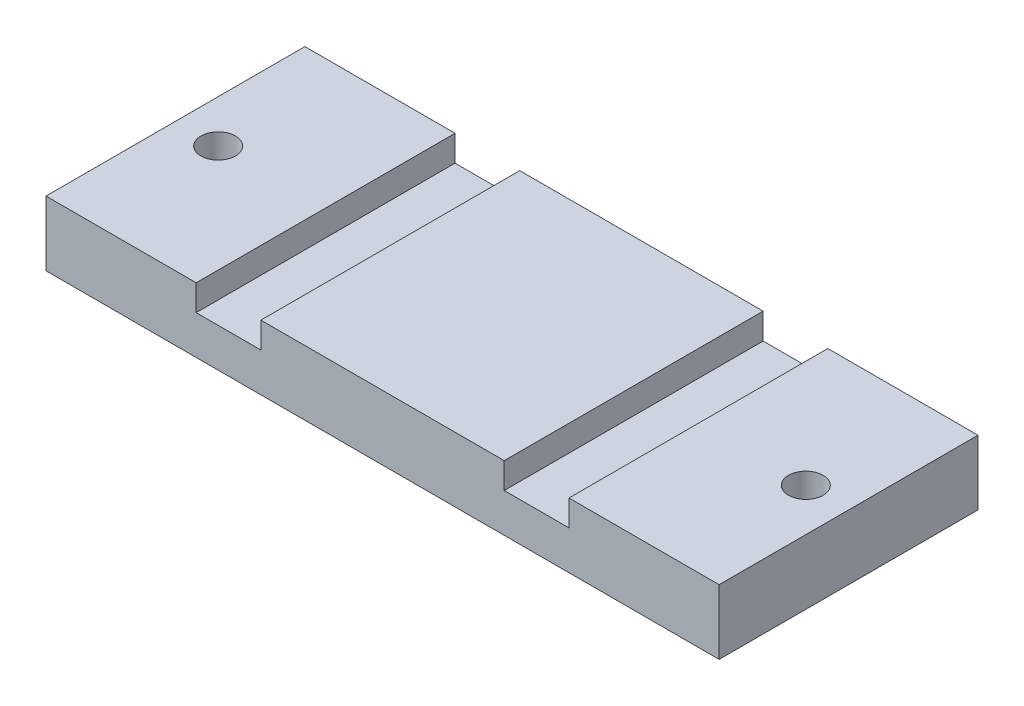
ISO-10303-21;
HEADER;
FILE_DESCRIPTION(('STEP AP214'),'2;1');
FILE_NAME('part.step','',(''),(''),'','','');
FILE_SCHEMA(('AUTOMOTIVE_DESIGN { 1 0 10303 214 1 1 1 1 }'));
ENDSEC;
DATA;
#1=APPLICATION_CONTEXT('core data for automotive mechanical design processes');
#2=APPLICATION_PROTOCOL_DEFINITION('international standard','automotive_design',2000,#1);
#3=PRODUCT_CONTEXT('',#1,'mechanical');
#4=PRODUCT('Part','Part','',(#3));
#5=PRODUCT_RELATED_PRODUCT_CATEGORY('part','',(#4));
#6=PRODUCT_DEFINITION_FORMATION('','',#4);
#7=PRODUCT_DEFINITION_CONTEXT('part definition',#1,'design');
#8=PRODUCT_DEFINITION('design','',#6,#7);
#9=PRODUCT_DEFINITION_SHAPE('','',#8);
#10=(LENGTH_UNIT() NAMED_UNIT(*) SI_UNIT(.MILLI.,.METRE.));
#11=(NAMED_UNIT(*) PLANE_ANGLE_UNIT() SI_UNIT($,.RADIAN.));
#12=(NAMED_UNIT(*) SI_UNIT($,.STERADIAN.) SOLID_ANGLE_UNIT());
#13=UNCERTAINTY_MEASURE_WITH_UNIT(LENGTH_MEASURE(1.E-05),#10,'distance_accuracy_value','');
#14=(GEOMETRIC_REPRESENTATION_CONTEXT(3) GLOBAL_UNCERTAINTY_ASSIGNED_CONTEXT((#13)) GLOBAL_UNIT_ASSIGNED_CONTEXT((#10,
#11,#12)) REPRESENTATION_CONTEXT('',''));
#15=CARTESIAN_POINT('',(0.,0.,0.));
#16=DIRECTION('',(0.,0.,1.));
#17=DIRECTION('',(1.,0.,0.));
#18=AXIS2_PLACEMENT_3D('',#15,#16,#17);
#19=CARTESIAN_POINT('',(0.,6.35,0.));
#20=DIRECTION('',(0.,-1.,0.));
#21=DIRECTION('',(0.,0.,-1.));
#22=AXIS2_PLACEMENT_3D('',#19,#20,#21);
#23=PLANE('',#22);
#24=CARTESIAN_POINT('',(4.191,6.35,-12.7));
#25=DIRECTION('',(0.,1.,0.));
#26=DIRECTION('',(0.,0.,1.));
#27=AXIS2_PLACEMENT_3D('',#24,#25,#26);
#28=CIRCLE('',#27,1.7);
#29=CARTESIAN_POINT('',(4.191,6.35,-11.));
#30=VERTEX_POINT('',#29);
#31=EDGE_CURVE('E174',#30,#30,#28,.T.);
#32=ORIENTED_EDGE('',*,*,#31,.F.);
#33=EDGE_LOOP('',(#32));
#34=FACE_BOUND('',#33,.T.);
#35=DIRECTION('',(1.,0.,0.));
#36=VECTOR('',#35,1.);
#37=CARTESIAN_POINT('',(0.,6.35,0.));
#38=LINE('',#37,#36);
#39=CARTESIAN_POINT('',(0.,6.35,0.));
#40=VERTEX_POINT('',#39);
#41=CARTESIAN_POINT('',(14.732,6.35,0.));
#42=VERTEX_POINT('',#41);
#43=EDGE_CURVE('E235',#40,#42,#38,.T.);
#44=ORIENTED_EDGE('',*,*,#43,.T.);
#45=DIRECTION('',(0.,0.,1.));
#46=VECTOR('',#45,1.);
#47=CARTESIAN_POINT('',(14.732,6.35,-25.4));
#48=LINE('',#47,#46);
#49=CARTESIAN_POINT('',(14.732,6.35,-25.4));
#50=VERTEX_POINT('',#49);
#51=EDGE_CURVE('E171',#50,#42,#48,.T.);
#52=ORIENTED_EDGE('',*,*,#51,.F.);
#53=DIRECTION('',(-1.,0.,0.));
#54=VECTOR('',#53,1.);
#55=CARTESIAN_POINT('',(0.,6.35,-25.4));
#56=LINE('',#55,#54);
#57=CARTESIAN_POINT('',(0.,6.35,-25.4));
#58=VERTEX_POINT('',#57);
#59=EDGE_CURVE('E156',#50,#58,#56,.T.);
#60=ORIENTED_EDGE('',*,*,#59,.T.);
#61=DIRECTION('',(0.,0.,1.));
#62=VECTOR('',#61,1.);
#63=CARTESIAN_POINT('',(0.,6.35,0.));
#64=LINE('',#63,#62);
#65=EDGE_CURVE('E229',#58,#40,#64,.T.);
#66=ORIENTED_EDGE('',*,*,#65,.T.);
#67=EDGE_LOOP('',(#44,#52,#60,#66));
#68=FACE_BOUND('',#67,.T.);
#69=ADVANCED_FACE('F41',(#34,#68),#23,.F.);
#70=CARTESIAN_POINT('',(61.849,6.35,-12.7));
#71=DIRECTION('',(0.,1.,0.));
#72=DIRECTION('',(0.,0.,1.));
#73=AXIS2_PLACEMENT_3D('',#70,#71,#72);
#74=CIRCLE('',#73,1.69999999999999);
#75=CARTESIAN_POINT('',(61.849,6.35,-11.));
#76=VERTEX_POINT('',#75);
#77=EDGE_CURVE('E220',#76,#76,#74,.T.);
#78=ORIENTED_EDGE('',*,*,#77,.F.);
#79=EDGE_LOOP('',(#78));
#80=FACE_BOUND('',#79,.T.);
#81=CARTESIAN_POINT('',(66.04,6.35,-25.4));
#82=VERTEX_POINT('',#81);
#83=CARTESIAN_POINT('',(51.308,6.35,-25.4));
#84=VERTEX_POINT('',#83);
#85=EDGE_CURVE('E243',#82,#84,#56,.T.);
#86=ORIENTED_EDGE('',*,*,#85,.T.);
#87=DIRECTION('',(0.,0.,1.));
#88=VECTOR('',#87,1.);
#89=CARTESIAN_POINT('',(51.308,6.35,-25.4));
#90=LINE('',#89,#88);
#91=CARTESIAN_POINT('',(51.308,6.35,0.));
#92=VERTEX_POINT('',#91);
#93=EDGE_CURVE('E191',#84,#92,#90,.T.);
#94=ORIENTED_EDGE('',*,*,#93,.T.);
#95=CARTESIAN_POINT('',(66.04,6.35,0.));
#96=VERTEX_POINT('',#95);
#97=EDGE_CURVE('E233',#92,#96,#38,.T.);
#98=ORIENTED_EDGE('',*,*,#97,.T.);
#99=DIRECTION('',(0.,0.,-1.));
#100=VECTOR('',#99,1.);
#101=CARTESIAN_POINT('',(66.04,6.35,0.));
#102=LINE('',#101,#100);
#103=EDGE_CURVE('E239',#96,#82,#102,.T.);
#104=ORIENTED_EDGE('',*,*,#103,.T.);
#105=EDGE_LOOP('',(#86,#94,#98,#104));
#106=FACE_BOUND('',#105,.T.);
#107=ADVANCED_FACE('F305',(#80,#106),#23,.F.);
#108=CARTESIAN_POINT('',(0.,6.35,0.));
#109=DIRECTION('',(1.,0.,0.));
#110=DIRECTION('',(0.,0.,-1.));
#111=AXIS2_PLACEMENT_3D('',#108,#109,#110);
#112=PLANE('',#111);
#113=DIRECTION('',(0.,0.,1.));
#114=VECTOR('',#113,1.);
#115=CARTESIAN_POINT('',(0.,0.,0.));
#116=LINE('',#115,#114);
#117=CARTESIAN_POINT('',(0.,0.,-25.4));
#118=VERTEX_POINT('',#117);
#119=CARTESIAN_POINT('',(0.,0.,0.));
#120=VERTEX_POINT('',#119);
#121=EDGE_CURVE('E228',#118,#120,#116,.T.);
#122=ORIENTED_EDGE('',*,*,#121,.T.);
#123=DIRECTION('',(0.,-1.,0.));
#124=VECTOR('',#123,1.);
#125=CARTESIAN_POINT('',(0.,6.35,0.));
#126=LINE('',#125,#124);
#127=EDGE_CURVE('E11',#40,#120,#126,.T.);
#128=ORIENTED_EDGE('',*,*,#127,.F.);
#129=ORIENTED_EDGE('',*,*,#65,.F.);
#130=DIRECTION('',(0.,-1.,0.));
#131=VECTOR('',#130,1.);
#132=CARTESIAN_POINT('',(0.,6.35,-25.4));
#133=LINE('',#132,#131);
#134=EDGE_CURVE('E247',#58,#118,#133,.T.);
#135=ORIENTED_EDGE('',*,*,#134,.T.);
#136=EDGE_LOOP('',(#122,#128,#129,#135));
#137=FACE_BOUND('',#136,.T.);
#138=ADVANCED_FACE('F43',(#137),#112,.F.);
#139=CARTESIAN_POINT('',(0.,6.35,0.));
#140=DIRECTION('',(0.,0.,-1.));
#141=DIRECTION('',(-1.,0.,0.));
#142=AXIS2_PLACEMENT_3D('',#139,#140,#141);
#143=PLANE('',#142);
#144=DIRECTION('',(1.,0.,0.));
#145=VECTOR('',#144,1.);
#146=CARTESIAN_POINT('',(14.732,3.81,0.));
#147=LINE('',#146,#145);
#148=CARTESIAN_POINT('',(14.732,3.81,0.));
#149=VERTEX_POINT('',#148);
#150=CARTESIAN_POINT('',(21.082,3.81,0.));
#151=VERTEX_POINT('',#150);
#152=EDGE_CURVE('E161',#149,#151,#147,.T.);
#153=ORIENTED_EDGE('',*,*,#152,.F.);
#154=DIRECTION('',(0.,-1.,0.));
#155=VECTOR('',#154,1.);
#156=CARTESIAN_POINT('',(14.732,6.35,0.));
#157=LINE('',#156,#155);
#158=EDGE_CURVE('E137',#42,#149,#157,.T.);
#159=ORIENTED_EDGE('',*,*,#158,.F.);
#160=ORIENTED_EDGE('',*,*,#43,.F.);
#161=ORIENTED_EDGE('',*,*,#127,.T.);
#162=DIRECTION('',(1.,0.,0.));
#163=VECTOR('',#162,1.);
#164=CARTESIAN_POINT('',(0.,0.,0.));
#165=LINE('',#164,#163);
#166=CARTESIAN_POINT('',(66.04,0.,0.));
#167=VERTEX_POINT('',#166);
#168=EDGE_CURVE('E252',#120,#167,#165,.T.);
#169=ORIENTED_EDGE('',*,*,#168,.T.);
#170=DIRECTION('',(0.,-1.,0.));
#171=VECTOR('',#170,1.);
#172=CARTESIAN_POINT('',(66.04,6.35,0.));
#173=LINE('',#172,#171);
#174=EDGE_CURVE('E50',#96,#167,#173,.T.);
#175=ORIENTED_EDGE('',*,*,#174,.F.);
#176=ORIENTED_EDGE('',*,*,#97,.F.);
#177=DIRECTION('',(0.,1.,0.));
#178=VECTOR('',#177,1.);
#179=CARTESIAN_POINT('',(51.308,6.35,0.));
#180=LINE('',#179,#178);
#181=CARTESIAN_POINT('',(51.308,3.81,0.));
#182=VERTEX_POINT('',#181);
#183=EDGE_CURVE('E192',#182,#92,#180,.T.);
#184=ORIENTED_EDGE('',*,*,#183,.F.);
#185=DIRECTION('',(1.,0.,0.));
#186=VECTOR('',#185,1.);
#187=CARTESIAN_POINT('',(51.308,3.81,0.));
#188=LINE('',#187,#186);
#189=CARTESIAN_POINT('',(44.958,3.81,0.));
#190=VERTEX_POINT('',#189);
#191=EDGE_CURVE('E184',#190,#182,#188,.T.);
#192=ORIENTED_EDGE('',*,*,#191,.F.);
#193=DIRECTION('',(0.,-1.,0.));
#194=VECTOR('',#193,1.);
#195=CARTESIAN_POINT('',(44.958,6.35,0.));
#196=LINE('',#195,#194);
#197=CARTESIAN_POINT('',(44.958,6.35,0.));
#198=VERTEX_POINT('',#197);
#199=EDGE_CURVE('E195',#198,#190,#196,.T.);
#200=ORIENTED_EDGE('',*,*,#199,.F.);
#201=CARTESIAN_POINT('',(21.082,6.35,0.));
#202=VERTEX_POINT('',#201);
#203=EDGE_CURVE('E240',#202,#198,#38,.T.);
#204=ORIENTED_EDGE('',*,*,#203,.F.);
#205=DIRECTION('',(0.,1.,0.));
#206=VECTOR('',#205,1.);
#207=CARTESIAN_POINT('',(21.082,6.35,0.));
#208=LINE('',#207,#206);
#209=EDGE_CURVE('E65',#151,#202,#208,.T.);
#210=ORIENTED_EDGE('',*,*,#209,.F.);
#211=EDGE_LOOP('',(#153,#159,#160,#161,#169,#175,#176,#184,#192,#200,#204,#210));
#212=FACE_BOUND('',#211,.T.);
#213=ADVANCED_FACE('F297',(#212),#143,.F.);
#214=CARTESIAN_POINT('',(66.04,6.35,0.));
#215=DIRECTION('',(-1.,0.,0.));
#216=DIRECTION('',(0.,0.,1.));
#217=AXIS2_PLACEMENT_3D('',#214,#215,#216);
#218=PLANE('',#217);
#219=DIRECTION('',(0.,0.,-1.));
#220=VECTOR('',#219,1.);
#221=CARTESIAN_POINT('',(66.04,0.,0.));
#222=LINE('',#221,#220);
#223=CARTESIAN_POINT('',(66.04,0.,-25.4));
#224=VERTEX_POINT('',#223);
#225=EDGE_CURVE('E255',#167,#224,#222,.T.);
#226=ORIENTED_EDGE('',*,*,#225,.T.);
#227=DIRECTION('',(0.,-1.,0.));
#228=VECTOR('',#227,1.);
#229=CARTESIAN_POINT('',(66.04,6.35,-25.4));
#230=LINE('',#229,#228);
#231=EDGE_CURVE('E263',#82,#224,#230,.T.);
#232=ORIENTED_EDGE('',*,*,#231,.F.);
#233=ORIENTED_EDGE('',*,*,#103,.F.);
#234=ORIENTED_EDGE('',*,*,#174,.T.);
#235=EDGE_LOOP('',(#226,#232,#233,#234));
#236=FACE_BOUND('',#235,.T.);
#237=ADVANCED_FACE('F273',(#236),#218,.F.);
#238=CARTESIAN_POINT('',(0.,6.35,-25.4));
#239=DIRECTION('',(0.,0.,1.));
#240=DIRECTION('',(1.,0.,0.));
#241=AXIS2_PLACEMENT_3D('',#238,#239,#240);
#242=PLANE('',#241);
#243=ORIENTED_EDGE('',*,*,#59,.F.);
#244=DIRECTION('',(0.,-1.,0.));
#245=VECTOR('',#244,1.);
#246=CARTESIAN_POINT('',(14.732,6.35,-25.4));
#247=LINE('',#246,#245);
#248=CARTESIAN_POINT('',(14.732,3.81,-25.4));
#249=VERTEX_POINT('',#248);
#250=EDGE_CURVE('E134',#50,#249,#247,.T.);
#251=ORIENTED_EDGE('',*,*,#250,.T.);
#252=DIRECTION('',(1.,0.,0.));
#253=VECTOR('',#252,1.);
#254=CARTESIAN_POINT('',(14.732,3.81,-25.4));
#255=LINE('',#254,#253);
#256=CARTESIAN_POINT('',(21.082,3.81,-25.4));
#257=VERTEX_POINT('',#256);
#258=EDGE_CURVE('E146',#249,#257,#255,.T.);
#259=ORIENTED_EDGE('',*,*,#258,.T.);
#260=DIRECTION('',(0.,1.,0.));
#261=VECTOR('',#260,1.);
#262=CARTESIAN_POINT('',(21.082,6.35,-25.4));
#263=LINE('',#262,#261);
#264=CARTESIAN_POINT('',(21.082,6.35,-25.4));
#265=VERTEX_POINT('',#264);
#266=EDGE_CURVE('E143',#257,#265,#263,.T.);
#267=ORIENTED_EDGE('',*,*,#266,.T.);
#268=CARTESIAN_POINT('',(44.958,6.35,-25.4));
#269=VERTEX_POINT('',#268);
#270=EDGE_CURVE('E248',#269,#265,#56,.T.);
#271=ORIENTED_EDGE('',*,*,#270,.F.);
#272=DIRECTION('',(0.,-1.,0.));
#273=VECTOR('',#272,1.);
#274=CARTESIAN_POINT('',(44.958,6.35,-25.4));
#275=LINE('',#274,#273);
#276=CARTESIAN_POINT('',(44.958,3.81,-25.4));
#277=VERTEX_POINT('',#276);
#278=EDGE_CURVE('E57',#269,#277,#275,.T.);
#279=ORIENTED_EDGE('',*,*,#278,.T.);
#280=DIRECTION('',(1.,0.,0.));
#281=VECTOR('',#280,1.);
#282=CARTESIAN_POINT('',(51.308,3.81,-25.4));
#283=LINE('',#282,#281);
#284=CARTESIAN_POINT('',(51.308,3.81,-25.4));
#285=VERTEX_POINT('',#284);
#286=EDGE_CURVE('E187',#277,#285,#283,.T.);
#287=ORIENTED_EDGE('',*,*,#286,.T.);
#288=DIRECTION('',(0.,1.,0.));
#289=VECTOR('',#288,1.);
#290=CARTESIAN_POINT('',(51.308,6.35,-25.4));
#291=LINE('',#290,#289);
#292=EDGE_CURVE('E180',#285,#84,#291,.T.);
#293=ORIENTED_EDGE('',*,*,#292,.T.);
#294=ORIENTED_EDGE('',*,*,#85,.F.);
#295=ORIENTED_EDGE('',*,*,#231,.T.);
#296=DIRECTION('',(-1.,0.,0.));
#297=VECTOR('',#296,1.);
#298=CARTESIAN_POINT('',(0.,0.,-25.4));
#299=LINE('',#298,#297);
#300=EDGE_CURVE('E234',#224,#118,#299,.T.);
#301=ORIENTED_EDGE('',*,*,#300,.T.);
#302=ORIENTED_EDGE('',*,*,#134,.F.);
#303=EDGE_LOOP('',(#243,#251,#259,#267,#271,#279,#287,#293,#294,#295,#301,#302));
#304=FACE_BOUND('',#303,.T.);
#305=ADVANCED_FACE('F154',(#304),#242,.F.);
#306=ORIENTED_EDGE('',*,*,#270,.T.);
#307=DIRECTION('',(0.,0.,1.));
#308=VECTOR('',#307,1.);
#309=CARTESIAN_POINT('',(21.082,6.35,-25.4));
#310=LINE('',#309,#308);
#311=EDGE_CURVE('E175',#265,#202,#310,.T.);
#312=ORIENTED_EDGE('',*,*,#311,.T.);
#313=ORIENTED_EDGE('',*,*,#203,.T.);
#314=DIRECTION('',(0.,0.,1.));
#315=VECTOR('',#314,1.);
#316=CARTESIAN_POINT('',(44.958,6.35,-25.4));
#317=LINE('',#316,#315);
#318=EDGE_CURVE('E207',#269,#198,#317,.T.);
#319=ORIENTED_EDGE('',*,*,#318,.F.);
#320=EDGE_LOOP('',(#306,#312,#313,#319));
#321=FACE_BOUND('',#320,.T.);
#322=ADVANCED_FACE('F293',(#321),#23,.F.);
#323=CARTESIAN_POINT('',(0.,0.,0.));
#324=DIRECTION('',(0.,-1.,0.));
#325=DIRECTION('',(0.,0.,-1.));
#326=AXIS2_PLACEMENT_3D('',#323,#324,#325);
#327=PLANE('',#326);
#328=CARTESIAN_POINT('',(4.191,0.,-12.7));
#329=DIRECTION('',(0.,1.,0.));
#330=DIRECTION('',(0.,0.,1.));
#331=AXIS2_PLACEMENT_3D('',#328,#329,#330);
#332=CIRCLE('',#331,1.7);
#333=CARTESIAN_POINT('',(4.191,0.,-11.));
#334=VERTEX_POINT('',#333);
#335=EDGE_CURVE('E216',#334,#334,#332,.T.);
#336=ORIENTED_EDGE('',*,*,#335,.T.);
#337=EDGE_LOOP('',(#336));
#338=FACE_BOUND('',#337,.T.);
#339=CARTESIAN_POINT('',(61.849,0.,-12.7));
#340=DIRECTION('',(0.,1.,0.));
#341=DIRECTION('',(0.,0.,1.));
#342=AXIS2_PLACEMENT_3D('',#339,#340,#341);
#343=CIRCLE('',#342,1.69999999999999);
#344=CARTESIAN_POINT('',(61.849,0.,-11.));
#345=VERTEX_POINT('',#344);
#346=EDGE_CURVE('E224',#345,#345,#343,.T.);
#347=ORIENTED_EDGE('',*,*,#346,.T.);
#348=EDGE_LOOP('',(#347));
#349=FACE_BOUND('',#348,.T.);
#350=ORIENTED_EDGE('',*,*,#121,.F.);
#351=ORIENTED_EDGE('',*,*,#300,.F.);
#352=ORIENTED_EDGE('',*,*,#225,.F.);
#353=ORIENTED_EDGE('',*,*,#168,.F.);
#354=EDGE_LOOP('',(#350,#351,#352,#353));
#355=FACE_BOUND('',#354,.T.);
#356=ADVANCED_FACE('F280',(#338,#349,#355),#327,.T.);
#357=CARTESIAN_POINT('',(61.849,6.35,-12.7));
#358=DIRECTION('',(0.,1.,0.));
#359=DIRECTION('',(0.,0.,1.));
#360=AXIS2_PLACEMENT_3D('',#357,#358,#359);
#361=CYLINDRICAL_SURFACE('',#360,1.69999999999999);
#362=ORIENTED_EDGE('',*,*,#346,.F.);
#363=EDGE_LOOP('',(#362));
#364=FACE_BOUND('',#363,.T.);
#365=ORIENTED_EDGE('',*,*,#77,.T.);
#366=EDGE_LOOP('',(#365));
#367=FACE_BOUND('',#366,.T.);
#368=ADVANCED_FACE('F338',(#364,#367),#361,.F.);
#369=CARTESIAN_POINT('',(4.191,6.35,-12.7));
#370=DIRECTION('',(0.,1.,0.));
#371=DIRECTION('',(0.,0.,1.));
#372=AXIS2_PLACEMENT_3D('',#369,#370,#371);
#373=CYLINDRICAL_SURFACE('',#372,1.7);
#374=ORIENTED_EDGE('',*,*,#335,.F.);
#375=EDGE_LOOP('',(#374));
#376=FACE_BOUND('',#375,.T.);
#377=ORIENTED_EDGE('',*,*,#31,.T.);
#378=EDGE_LOOP('',(#377));
#379=FACE_BOUND('',#378,.T.);
#380=ADVANCED_FACE('F368',(#376,#379),#373,.F.);
#381=CARTESIAN_POINT('',(51.308,6.35,-25.4));
#382=DIRECTION('',(1.,0.,0.));
#383=DIRECTION('',(0.,0.,-1.));
#384=AXIS2_PLACEMENT_3D('',#381,#382,#383);
#385=PLANE('',#384);
#386=ORIENTED_EDGE('',*,*,#183,.T.);
#387=ORIENTED_EDGE('',*,*,#93,.F.);
#388=ORIENTED_EDGE('',*,*,#292,.F.);
#389=DIRECTION('',(0.,0.,1.));
#390=VECTOR('',#389,1.);
#391=CARTESIAN_POINT('',(51.308,3.81,-25.4));
#392=LINE('',#391,#390);
#393=EDGE_CURVE('E168',#285,#182,#392,.T.);
#394=ORIENTED_EDGE('',*,*,#393,.T.);
#395=EDGE_LOOP('',(#386,#387,#388,#394));
#396=FACE_BOUND('',#395,.T.);
#397=ADVANCED_FACE('F308',(#396),#385,.F.);
#398=CARTESIAN_POINT('',(51.308,3.81,-25.4));
#399=DIRECTION('',(0.,-1.,0.));
#400=DIRECTION('',(1.,0.,0.));
#401=AXIS2_PLACEMENT_3D('',#398,#399,#400);
#402=PLANE('',#401);
#403=ORIENTED_EDGE('',*,*,#191,.T.);
#404=ORIENTED_EDGE('',*,*,#393,.F.);
#405=ORIENTED_EDGE('',*,*,#286,.F.);
#406=DIRECTION('',(0.,0.,1.));
#407=VECTOR('',#406,1.);
#408=CARTESIAN_POINT('',(44.958,3.81,-25.4));
#409=LINE('',#408,#407);
#410=EDGE_CURVE('E204',#277,#190,#409,.T.);
#411=ORIENTED_EDGE('',*,*,#410,.T.);
#412=EDGE_LOOP('',(#403,#404,#405,#411));
#413=FACE_BOUND('',#412,.T.);
#414=ADVANCED_FACE('F312',(#413),#402,.F.);
#415=CARTESIAN_POINT('',(44.958,6.35,-25.4));
#416=DIRECTION('',(-1.,0.,0.));
#417=DIRECTION('',(0.,0.,1.));
#418=AXIS2_PLACEMENT_3D('',#415,#416,#417);
#419=PLANE('',#418);
#420=ORIENTED_EDGE('',*,*,#199,.T.);
#421=ORIENTED_EDGE('',*,*,#410,.F.);
#422=ORIENTED_EDGE('',*,*,#278,.F.);
#423=ORIENTED_EDGE('',*,*,#318,.T.);
#424=EDGE_LOOP('',(#420,#421,#422,#423));
#425=FACE_BOUND('',#424,.T.);
#426=ADVANCED_FACE('F313',(#425),#419,.F.);
#427=CARTESIAN_POINT('',(14.732,6.35,-25.4));
#428=DIRECTION('',(-1.,0.,0.));
#429=DIRECTION('',(0.,0.,1.));
#430=AXIS2_PLACEMENT_3D('',#427,#428,#429);
#431=PLANE('',#430);
#432=ORIENTED_EDGE('',*,*,#158,.T.);
#433=DIRECTION('',(0.,0.,1.));
#434=VECTOR('',#433,1.);
#435=CARTESIAN_POINT('',(14.732,3.81,-25.4));
#436=LINE('',#435,#434);
#437=EDGE_CURVE('E130',#249,#149,#436,.T.);
#438=ORIENTED_EDGE('',*,*,#437,.F.);
#439=ORIENTED_EDGE('',*,*,#250,.F.);
#440=ORIENTED_EDGE('',*,*,#51,.T.);
#441=EDGE_LOOP('',(#432,#438,#439,#440));
#442=FACE_BOUND('',#441,.T.);
#443=ADVANCED_FACE('F132',(#442),#431,.F.);
#444=CARTESIAN_POINT('',(21.082,6.35,-25.4));
#445=DIRECTION('',(1.,0.,0.));
#446=DIRECTION('',(0.,0.,-1.));
#447=AXIS2_PLACEMENT_3D('',#444,#445,#446);
#448=PLANE('',#447);
#449=ORIENTED_EDGE('',*,*,#209,.T.);
#450=ORIENTED_EDGE('',*,*,#311,.F.);
#451=ORIENTED_EDGE('',*,*,#266,.F.);
#452=DIRECTION('',(0.,0.,1.));
#453=VECTOR('',#452,1.);
#454=CARTESIAN_POINT('',(21.082,3.81,-25.4));
#455=LINE('',#454,#453);
#456=EDGE_CURVE('E142',#257,#151,#455,.T.);
#457=ORIENTED_EDGE('',*,*,#456,.T.);
#458=EDGE_LOOP('',(#449,#450,#451,#457));
#459=FACE_BOUND('',#458,.T.);
#460=ADVANCED_FACE('F296',(#459),#448,.F.);
#461=CARTESIAN_POINT('',(14.732,3.81,-25.4));
#462=DIRECTION('',(0.,-1.,0.));
#463=DIRECTION('',(0.,0.,-1.));
#464=AXIS2_PLACEMENT_3D('',#461,#462,#463);
#465=PLANE('',#464);
#466=ORIENTED_EDGE('',*,*,#152,.T.);
#467=ORIENTED_EDGE('',*,*,#456,.F.);
#468=ORIENTED_EDGE('',*,*,#258,.F.);
#469=ORIENTED_EDGE('',*,*,#437,.T.);
#470=EDGE_LOOP('',(#466,#467,#468,#469));
#471=FACE_BOUND('',#470,.T.);
#472=ADVANCED_FACE('F147',(#471),#465,.F.);
#473=CLOSED_SHELL('',(#69,#107,#138,#213,#237,#305,#322,#356,#368,#380,#397,#414,#426,#443,#460,#472));
#474=MANIFOLD_SOLID_BREP('B2',#473);
#475=ADVANCED_BREP_SHAPE_REPRESENTATION('',(#18,#474),#14);
#476=SHAPE_DEFINITION_REPRESENTATION(#9,#475);
ENDSEC;
END-ISO-10303-21;
